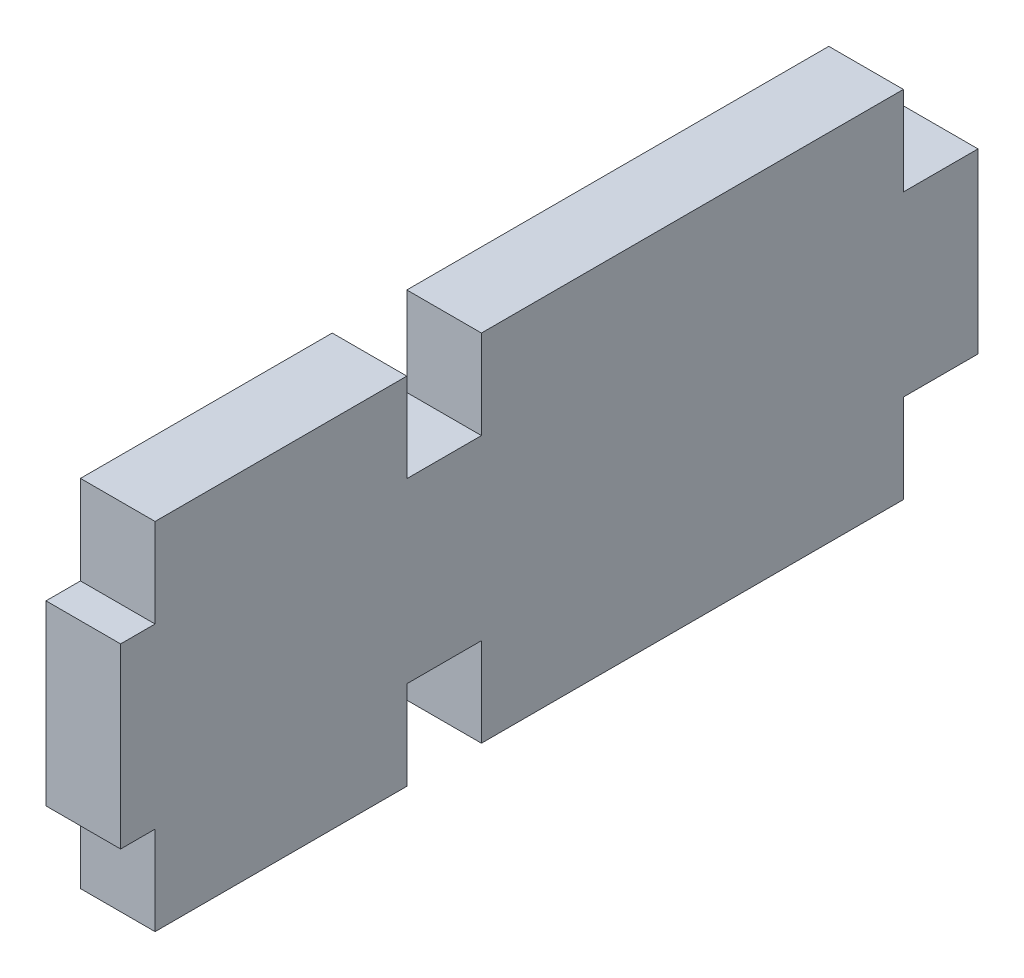
ISO-10303-21;
HEADER;
FILE_DESCRIPTION(('STEP AP214'),'2;1');
FILE_NAME('part.step','',(''),(''),'','','');
FILE_SCHEMA(('AUTOMOTIVE_DESIGN { 1 0 10303 214 1 1 1 1 }'));
ENDSEC;
DATA;
#1=APPLICATION_CONTEXT('core data for automotive mechanical design processes');
#2=APPLICATION_PROTOCOL_DEFINITION('international standard','automotive_design',2000,#1);
#3=PRODUCT_CONTEXT('',#1,'mechanical');
#4=PRODUCT('Part','Part','',(#3));
#5=PRODUCT_RELATED_PRODUCT_CATEGORY('part','',(#4));
#6=PRODUCT_DEFINITION_FORMATION('','',#4);
#7=PRODUCT_DEFINITION_CONTEXT('part definition',#1,'design');
#8=PRODUCT_DEFINITION('design','',#6,#7);
#9=PRODUCT_DEFINITION_SHAPE('','',#8);
#10=(LENGTH_UNIT() NAMED_UNIT(*) SI_UNIT(.MILLI.,.METRE.));
#11=(NAMED_UNIT(*) PLANE_ANGLE_UNIT() SI_UNIT($,.RADIAN.));
#12=(NAMED_UNIT(*) SI_UNIT($,.STERADIAN.) SOLID_ANGLE_UNIT());
#13=UNCERTAINTY_MEASURE_WITH_UNIT(LENGTH_MEASURE(1.E-05),#10,'distance_accuracy_value','');
#14=(GEOMETRIC_REPRESENTATION_CONTEXT(3) GLOBAL_UNCERTAINTY_ASSIGNED_CONTEXT((#13)) GLOBAL_UNIT_ASSIGNED_CONTEXT((#10,
#11,#12)) REPRESENTATION_CONTEXT('',''));
#15=CARTESIAN_POINT('',(0.,0.,0.));
#16=DIRECTION('',(0.,0.,1.));
#17=DIRECTION('',(1.,0.,0.));
#18=AXIS2_PLACEMENT_3D('',#15,#16,#17);
#19=CARTESIAN_POINT('',(5.334,0.,0.));
#20=DIRECTION('',(0.,1.,0.));
#21=DIRECTION('',(0.,0.,1.));
#22=AXIS2_PLACEMENT_3D('',#19,#20,#21);
#23=PLANE('',#22);
#24=DIRECTION('',(0.,0.,-1.));
#25=VECTOR('',#24,1.);
#26=CARTESIAN_POINT('',(0.,0.,0.));
#27=LINE('',#26,#25);
#28=CARTESIAN_POINT('',(0.,0.,-2.4638));
#29=VERTEX_POINT('',#28);
#30=CARTESIAN_POINT('',(0.,0.,-20.4638));
#31=VERTEX_POINT('',#30);
#32=EDGE_CURVE('E202',#29,#31,#27,.T.);
#33=ORIENTED_EDGE('',*,*,#32,.T.);
#34=DIRECTION('',(1.,0.,0.));
#35=VECTOR('',#34,1.);
#36=CARTESIAN_POINT('',(0.,0.,-20.4638));
#37=LINE('',#36,#35);
#38=CARTESIAN_POINT('',(5.334,0.,-20.4638));
#39=VERTEX_POINT('',#38);
#40=EDGE_CURVE('E280',#31,#39,#37,.T.);
#41=ORIENTED_EDGE('',*,*,#40,.T.);
#42=DIRECTION('',(0.,0.,-1.));
#43=VECTOR('',#42,1.);
#44=CARTESIAN_POINT('',(5.334,0.,0.));
#45=LINE('',#44,#43);
#46=CARTESIAN_POINT('',(5.334,0.,-2.4638));
#47=VERTEX_POINT('',#46);
#48=EDGE_CURVE('E218',#47,#39,#45,.T.);
#49=ORIENTED_EDGE('',*,*,#48,.F.);
#50=DIRECTION('',(1.,0.,0.));
#51=VECTOR('',#50,1.);
#52=CARTESIAN_POINT('',(0.,0.,-2.4638));
#53=LINE('',#52,#51);
#54=EDGE_CURVE('E239',#29,#47,#53,.T.);
#55=ORIENTED_EDGE('',*,*,#54,.F.);
#56=EDGE_LOOP('',(#33,#41,#49,#55));
#57=FACE_BOUND('',#56,.T.);
#58=ADVANCED_FACE('F32',(#57),#23,.F.);
#59=CARTESIAN_POINT('',(5.334,25.4,0.));
#60=DIRECTION('',(0.,-1.,0.));
#61=DIRECTION('',(0.,0.,-1.));
#62=AXIS2_PLACEMENT_3D('',#59,#60,#61);
#63=PLANE('',#62);
#64=DIRECTION('',(0.,0.,1.));
#65=VECTOR('',#64,1.);
#66=CARTESIAN_POINT('',(5.334,25.4,0.));
#67=LINE('',#66,#65);
#68=CARTESIAN_POINT('',(5.334,25.4,-20.4638));
#69=VERTEX_POINT('',#68);
#70=CARTESIAN_POINT('',(5.334,25.4,-2.4638));
#71=VERTEX_POINT('',#70);
#72=EDGE_CURVE('E41',#69,#71,#67,.T.);
#73=ORIENTED_EDGE('',*,*,#72,.F.);
#74=DIRECTION('',(1.,0.,0.));
#75=VECTOR('',#74,1.);
#76=CARTESIAN_POINT('',(0.,25.4,-20.4638));
#77=LINE('',#76,#75);
#78=CARTESIAN_POINT('',(0.,25.4,-20.4638));
#79=VERTEX_POINT('',#78);
#80=EDGE_CURVE('E252',#79,#69,#77,.T.);
#81=ORIENTED_EDGE('',*,*,#80,.F.);
#82=DIRECTION('',(0.,0.,1.));
#83=VECTOR('',#82,1.);
#84=CARTESIAN_POINT('',(0.,25.4,0.));
#85=LINE('',#84,#83);
#86=CARTESIAN_POINT('',(0.,25.4,-2.4638));
#87=VERTEX_POINT('',#86);
#88=EDGE_CURVE('E191',#79,#87,#85,.T.);
#89=ORIENTED_EDGE('',*,*,#88,.T.);
#90=DIRECTION('',(1.,0.,0.));
#91=VECTOR('',#90,1.);
#92=CARTESIAN_POINT('',(0.,25.4,-2.4638));
#93=LINE('',#92,#91);
#94=EDGE_CURVE('E213',#87,#71,#93,.T.);
#95=ORIENTED_EDGE('',*,*,#94,.T.);
#96=EDGE_LOOP('',(#73,#81,#89,#95));
#97=FACE_BOUND('',#96,.T.);
#98=ADVANCED_FACE('F378',(#97),#63,.F.);
#99=CARTESIAN_POINT('',(5.334,0.,0.));
#100=DIRECTION('',(0.,0.,-1.));
#101=DIRECTION('',(-1.,0.,0.));
#102=AXIS2_PLACEMENT_3D('',#99,#100,#101);
#103=PLANE('',#102);
#104=DIRECTION('',(0.,-1.,0.));
#105=VECTOR('',#104,1.);
#106=CARTESIAN_POINT('',(0.,0.,0.));
#107=LINE('',#106,#105);
#108=CARTESIAN_POINT('',(0.,19.05,0.));
#109=VERTEX_POINT('',#108);
#110=CARTESIAN_POINT('',(0.,6.35,0.));
#111=VERTEX_POINT('',#110);
#112=EDGE_CURVE('E211',#109,#111,#107,.T.);
#113=ORIENTED_EDGE('',*,*,#112,.T.);
#114=DIRECTION('',(1.,0.,0.));
#115=VECTOR('',#114,1.);
#116=CARTESIAN_POINT('',(0.,6.35,0.));
#117=LINE('',#116,#115);
#118=CARTESIAN_POINT('',(5.334,6.35,0.));
#119=VERTEX_POINT('',#118);
#120=EDGE_CURVE('E234',#111,#119,#117,.T.);
#121=ORIENTED_EDGE('',*,*,#120,.T.);
#122=DIRECTION('',(0.,-1.,0.));
#123=VECTOR('',#122,1.);
#124=CARTESIAN_POINT('',(5.334,0.,0.));
#125=LINE('',#124,#123);
#126=CARTESIAN_POINT('',(5.334,19.05,0.));
#127=VERTEX_POINT('',#126);
#128=EDGE_CURVE('E190',#127,#119,#125,.T.);
#129=ORIENTED_EDGE('',*,*,#128,.F.);
#130=DIRECTION('',(1.,0.,0.));
#131=VECTOR('',#130,1.);
#132=CARTESIAN_POINT('',(0.,19.05,0.));
#133=LINE('',#132,#131);
#134=EDGE_CURVE('E221',#109,#127,#133,.T.);
#135=ORIENTED_EDGE('',*,*,#134,.F.);
#136=EDGE_LOOP('',(#113,#121,#129,#135));
#137=FACE_BOUND('',#136,.T.);
#138=ADVANCED_FACE('F34',(#137),#103,.F.);
#139=CARTESIAN_POINT('',(0.,0.,-25.7978));
#140=VERTEX_POINT('',#139);
#141=CARTESIAN_POINT('',(0.,0.,-55.966));
#142=VERTEX_POINT('',#141);
#143=EDGE_CURVE('E208',#140,#142,#27,.T.);
#144=ORIENTED_EDGE('',*,*,#143,.T.);
#145=DIRECTION('',(1.,0.,0.));
#146=VECTOR('',#145,1.);
#147=CARTESIAN_POINT('',(0.,0.,-55.966));
#148=LINE('',#147,#146);
#149=CARTESIAN_POINT('',(5.334,0.,-55.966));
#150=VERTEX_POINT('',#149);
#151=EDGE_CURVE('E298',#142,#150,#148,.T.);
#152=ORIENTED_EDGE('',*,*,#151,.T.);
#153=CARTESIAN_POINT('',(5.334,0.,-25.7978));
#154=VERTEX_POINT('',#153);
#155=EDGE_CURVE('E193',#154,#150,#45,.T.);
#156=ORIENTED_EDGE('',*,*,#155,.F.);
#157=DIRECTION('',(1.,0.,0.));
#158=VECTOR('',#157,1.);
#159=CARTESIAN_POINT('',(0.,0.,-25.7978));
#160=LINE('',#159,#158);
#161=EDGE_CURVE('E283',#140,#154,#160,.T.);
#162=ORIENTED_EDGE('',*,*,#161,.F.);
#163=EDGE_LOOP('',(#144,#152,#156,#162));
#164=FACE_BOUND('',#163,.T.);
#165=ADVANCED_FACE('F343',(#164),#23,.F.);
#166=CARTESIAN_POINT('',(5.334,0.,-61.3));
#167=DIRECTION('',(0.,0.,1.));
#168=DIRECTION('',(1.,0.,0.));
#169=AXIS2_PLACEMENT_3D('',#166,#167,#168);
#170=PLANE('',#169);
#171=DIRECTION('',(0.,1.,0.));
#172=VECTOR('',#171,1.);
#173=CARTESIAN_POINT('',(0.,0.,-61.3));
#174=LINE('',#173,#172);
#175=CARTESIAN_POINT('',(0.,6.35,-61.3));
#176=VERTEX_POINT('',#175);
#177=CARTESIAN_POINT('',(0.,19.05,-61.3));
#178=VERTEX_POINT('',#177);
#179=EDGE_CURVE('E195',#176,#178,#174,.T.);
#180=ORIENTED_EDGE('',*,*,#179,.T.);
#181=DIRECTION('',(1.,0.,0.));
#182=VECTOR('',#181,1.);
#183=CARTESIAN_POINT('',(0.,19.05,-61.3));
#184=LINE('',#183,#182);
#185=CARTESIAN_POINT('',(5.334,19.05,-61.3));
#186=VERTEX_POINT('',#185);
#187=EDGE_CURVE('E318',#178,#186,#184,.T.);
#188=ORIENTED_EDGE('',*,*,#187,.T.);
#189=DIRECTION('',(0.,1.,0.));
#190=VECTOR('',#189,1.);
#191=CARTESIAN_POINT('',(5.334,0.,-61.3));
#192=LINE('',#191,#190);
#193=CARTESIAN_POINT('',(5.334,6.35,-61.3));
#194=VERTEX_POINT('',#193);
#195=EDGE_CURVE('E215',#194,#186,#192,.T.);
#196=ORIENTED_EDGE('',*,*,#195,.F.);
#197=DIRECTION('',(1.,0.,0.));
#198=VECTOR('',#197,1.);
#199=CARTESIAN_POINT('',(0.,6.35,-61.3));
#200=LINE('',#199,#198);
#201=EDGE_CURVE('E306',#176,#194,#200,.T.);
#202=ORIENTED_EDGE('',*,*,#201,.F.);
#203=EDGE_LOOP('',(#180,#188,#196,#202));
#204=FACE_BOUND('',#203,.T.);
#205=ADVANCED_FACE('F333',(#204),#170,.F.);
#206=CARTESIAN_POINT('',(5.334,25.4,-55.966));
#207=VERTEX_POINT('',#206);
#208=CARTESIAN_POINT('',(5.334,25.4,-25.7978));
#209=VERTEX_POINT('',#208);
#210=EDGE_CURVE('E11',#207,#209,#67,.T.);
#211=ORIENTED_EDGE('',*,*,#210,.F.);
#212=DIRECTION('',(1.,0.,0.));
#213=VECTOR('',#212,1.);
#214=CARTESIAN_POINT('',(0.,25.4,-55.966));
#215=LINE('',#214,#213);
#216=CARTESIAN_POINT('',(0.,25.4,-55.966));
#217=VERTEX_POINT('',#216);
#218=EDGE_CURVE('E173',#217,#207,#215,.T.);
#219=ORIENTED_EDGE('',*,*,#218,.F.);
#220=CARTESIAN_POINT('',(0.,25.4,-25.7978));
#221=VERTEX_POINT('',#220);
#222=EDGE_CURVE('E36',#217,#221,#85,.T.);
#223=ORIENTED_EDGE('',*,*,#222,.T.);
#224=DIRECTION('',(1.,0.,0.));
#225=VECTOR('',#224,1.);
#226=CARTESIAN_POINT('',(0.,25.4,-25.7978));
#227=LINE('',#226,#225);
#228=EDGE_CURVE('E261',#221,#209,#227,.T.);
#229=ORIENTED_EDGE('',*,*,#228,.T.);
#230=EDGE_LOOP('',(#211,#219,#223,#229));
#231=FACE_BOUND('',#230,.T.);
#232=ADVANCED_FACE('F182',(#231),#63,.F.);
#233=CARTESIAN_POINT('',(5.334,0.,0.));
#234=DIRECTION('',(-1.,0.,0.));
#235=DIRECTION('',(0.,0.,1.));
#236=AXIS2_PLACEMENT_3D('',#233,#234,#235);
#237=PLANE('',#236);
#238=ORIENTED_EDGE('',*,*,#195,.T.);
#239=DIRECTION('',(0.,0.,-1.));
#240=VECTOR('',#239,1.);
#241=CARTESIAN_POINT('',(5.334,19.05,-61.3));
#242=LINE('',#241,#240);
#243=CARTESIAN_POINT('',(5.334,19.05,-55.966));
#244=VERTEX_POINT('',#243);
#245=EDGE_CURVE('E178',#244,#186,#242,.T.);
#246=ORIENTED_EDGE('',*,*,#245,.F.);
#247=DIRECTION('',(0.,-1.,0.));
#248=VECTOR('',#247,1.);
#249=CARTESIAN_POINT('',(5.334,25.4,-55.966));
#250=LINE('',#249,#248);
#251=EDGE_CURVE('E325',#207,#244,#250,.T.);
#252=ORIENTED_EDGE('',*,*,#251,.F.);
#253=ORIENTED_EDGE('',*,*,#210,.T.);
#254=DIRECTION('',(0.,1.,0.));
#255=VECTOR('',#254,1.);
#256=CARTESIAN_POINT('',(5.334,25.4,-25.7978));
#257=LINE('',#256,#255);
#258=CARTESIAN_POINT('',(5.334,19.05,-25.7978));
#259=VERTEX_POINT('',#258);
#260=EDGE_CURVE('E264',#259,#209,#257,.T.);
#261=ORIENTED_EDGE('',*,*,#260,.F.);
#262=DIRECTION('',(0.,0.,-1.));
#263=VECTOR('',#262,1.);
#264=CARTESIAN_POINT('',(5.334,19.05,-20.4638));
#265=LINE('',#264,#263);
#266=CARTESIAN_POINT('',(5.334,19.05,-20.4638));
#267=VERTEX_POINT('',#266);
#268=EDGE_CURVE('E268',#267,#259,#265,.T.);
#269=ORIENTED_EDGE('',*,*,#268,.F.);
#270=DIRECTION('',(0.,-1.,0.));
#271=VECTOR('',#270,1.);
#272=CARTESIAN_POINT('',(5.334,25.4,-20.4638));
#273=LINE('',#272,#271);
#274=EDGE_CURVE('E271',#69,#267,#273,.T.);
#275=ORIENTED_EDGE('',*,*,#274,.F.);
#276=ORIENTED_EDGE('',*,*,#72,.T.);
#277=DIRECTION('',(0.,1.,0.));
#278=VECTOR('',#277,1.);
#279=CARTESIAN_POINT('',(5.334,25.4,-2.4638));
#280=LINE('',#279,#278);
#281=CARTESIAN_POINT('',(5.334,19.05,-2.4638));
#282=VERTEX_POINT('',#281);
#283=EDGE_CURVE('E227',#282,#71,#280,.T.);
#284=ORIENTED_EDGE('',*,*,#283,.F.);
#285=DIRECTION('',(0.,0.,-1.));
#286=VECTOR('',#285,1.);
#287=CARTESIAN_POINT('',(5.334,19.05,0.));
#288=LINE('',#287,#286);
#289=EDGE_CURVE('E231',#127,#282,#288,.T.);
#290=ORIENTED_EDGE('',*,*,#289,.F.);
#291=ORIENTED_EDGE('',*,*,#128,.T.);
#292=DIRECTION('',(0.,0.,1.));
#293=VECTOR('',#292,1.);
#294=CARTESIAN_POINT('',(5.334,6.35,0.));
#295=LINE('',#294,#293);
#296=CARTESIAN_POINT('',(5.334,6.35,-2.4638));
#297=VERTEX_POINT('',#296);
#298=EDGE_CURVE('E246',#297,#119,#295,.T.);
#299=ORIENTED_EDGE('',*,*,#298,.F.);
#300=DIRECTION('',(0.,1.,0.));
#301=VECTOR('',#300,1.);
#302=CARTESIAN_POINT('',(5.334,0.,-2.4638));
#303=LINE('',#302,#301);
#304=EDGE_CURVE('E249',#47,#297,#303,.T.);
#305=ORIENTED_EDGE('',*,*,#304,.F.);
#306=ORIENTED_EDGE('',*,*,#48,.T.);
#307=DIRECTION('',(0.,-1.,0.));
#308=VECTOR('',#307,1.);
#309=CARTESIAN_POINT('',(5.334,0.,-20.4638));
#310=LINE('',#309,#308);
#311=CARTESIAN_POINT('',(5.334,6.35,-20.4638));
#312=VERTEX_POINT('',#311);
#313=EDGE_CURVE('E296',#312,#39,#310,.T.);
#314=ORIENTED_EDGE('',*,*,#313,.F.);
#315=DIRECTION('',(0.,0.,1.));
#316=VECTOR('',#315,1.);
#317=CARTESIAN_POINT('',(5.334,6.35,-20.4638));
#318=LINE('',#317,#316);
#319=CARTESIAN_POINT('',(5.334,6.35,-25.7978));
#320=VERTEX_POINT('',#319);
#321=EDGE_CURVE('E289',#320,#312,#318,.T.);
#322=ORIENTED_EDGE('',*,*,#321,.F.);
#323=DIRECTION('',(0.,1.,0.));
#324=VECTOR('',#323,1.);
#325=CARTESIAN_POINT('',(5.334,0.,-25.7978));
#326=LINE('',#325,#324);
#327=EDGE_CURVE('E293',#154,#320,#326,.T.);
#328=ORIENTED_EDGE('',*,*,#327,.F.);
#329=ORIENTED_EDGE('',*,*,#155,.T.);
#330=DIRECTION('',(0.,-1.,0.));
#331=VECTOR('',#330,1.);
#332=CARTESIAN_POINT('',(5.334,0.,-55.966));
#333=LINE('',#332,#331);
#334=CARTESIAN_POINT('',(5.334,6.35,-55.966));
#335=VERTEX_POINT('',#334);
#336=EDGE_CURVE('E312',#335,#150,#333,.T.);
#337=ORIENTED_EDGE('',*,*,#336,.F.);
#338=DIRECTION('',(0.,0.,1.));
#339=VECTOR('',#338,1.);
#340=CARTESIAN_POINT('',(5.334,6.35,-61.3));
#341=LINE('',#340,#339);
#342=EDGE_CURVE('E315',#194,#335,#341,.T.);
#343=ORIENTED_EDGE('',*,*,#342,.F.);
#344=EDGE_LOOP('',(#238,#246,#252,#253,#261,#269,#275,#276,#284,#290,#291,#299,#305,#306,#314,
#322,#328,#329,#337,#343));
#345=FACE_BOUND('',#344,.T.);
#346=ADVANCED_FACE('F336',(#345),#237,.F.);
#347=CARTESIAN_POINT('',(0.,0.,0.));
#348=DIRECTION('',(-1.,0.,0.));
#349=DIRECTION('',(0.,0.,1.));
#350=AXIS2_PLACEMENT_3D('',#347,#348,#349);
#351=PLANE('',#350);
#352=DIRECTION('',(0.,0.,-1.));
#353=VECTOR('',#352,1.);
#354=CARTESIAN_POINT('',(0.,19.05,-61.3));
#355=LINE('',#354,#353);
#356=CARTESIAN_POINT('',(0.,19.05,-55.966));
#357=VERTEX_POINT('',#356);
#358=EDGE_CURVE('E49',#357,#178,#355,.T.);
#359=ORIENTED_EDGE('',*,*,#358,.T.);
#360=ORIENTED_EDGE('',*,*,#179,.F.);
#361=DIRECTION('',(0.,0.,1.));
#362=VECTOR('',#361,1.);
#363=CARTESIAN_POINT('',(0.,6.35,-61.3));
#364=LINE('',#363,#362);
#365=CARTESIAN_POINT('',(0.,6.35,-55.966));
#366=VERTEX_POINT('',#365);
#367=EDGE_CURVE('E314',#176,#366,#364,.T.);
#368=ORIENTED_EDGE('',*,*,#367,.T.);
#369=DIRECTION('',(0.,-1.,0.));
#370=VECTOR('',#369,1.);
#371=CARTESIAN_POINT('',(0.,0.,-55.966));
#372=LINE('',#371,#370);
#373=EDGE_CURVE('E57',#366,#142,#372,.T.);
#374=ORIENTED_EDGE('',*,*,#373,.T.);
#375=ORIENTED_EDGE('',*,*,#143,.F.);
#376=DIRECTION('',(0.,1.,0.));
#377=VECTOR('',#376,1.);
#378=CARTESIAN_POINT('',(0.,0.,-25.7978));
#379=LINE('',#378,#377);
#380=CARTESIAN_POINT('',(0.,6.35,-25.7978));
#381=VERTEX_POINT('',#380);
#382=EDGE_CURVE('E301',#140,#381,#379,.T.);
#383=ORIENTED_EDGE('',*,*,#382,.T.);
#384=DIRECTION('',(0.,0.,1.));
#385=VECTOR('',#384,1.);
#386=CARTESIAN_POINT('',(0.,6.35,-20.4638));
#387=LINE('',#386,#385);
#388=CARTESIAN_POINT('',(0.,6.35,-20.4638));
#389=VERTEX_POINT('',#388);
#390=EDGE_CURVE('E284',#381,#389,#387,.T.);
#391=ORIENTED_EDGE('',*,*,#390,.T.);
#392=DIRECTION('',(0.,-1.,0.));
#393=VECTOR('',#392,1.);
#394=CARTESIAN_POINT('',(0.,0.,-20.4638));
#395=LINE('',#394,#393);
#396=EDGE_CURVE('E292',#389,#31,#395,.T.);
#397=ORIENTED_EDGE('',*,*,#396,.T.);
#398=ORIENTED_EDGE('',*,*,#32,.F.);
#399=DIRECTION('',(0.,1.,0.));
#400=VECTOR('',#399,1.);
#401=CARTESIAN_POINT('',(0.,0.,-2.4638));
#402=LINE('',#401,#400);
#403=CARTESIAN_POINT('',(0.,6.35,-2.4638));
#404=VERTEX_POINT('',#403);
#405=EDGE_CURVE('E248',#29,#404,#402,.T.);
#406=ORIENTED_EDGE('',*,*,#405,.T.);
#407=DIRECTION('',(0.,0.,1.));
#408=VECTOR('',#407,1.);
#409=CARTESIAN_POINT('',(0.,6.35,0.));
#410=LINE('',#409,#408);
#411=EDGE_CURVE('E242',#404,#111,#410,.T.);
#412=ORIENTED_EDGE('',*,*,#411,.T.);
#413=ORIENTED_EDGE('',*,*,#112,.F.);
#414=DIRECTION('',(0.,0.,-1.));
#415=VECTOR('',#414,1.);
#416=CARTESIAN_POINT('',(0.,19.05,0.));
#417=LINE('',#416,#415);
#418=CARTESIAN_POINT('',(0.,19.05,-2.4638));
#419=VERTEX_POINT('',#418);
#420=EDGE_CURVE('E230',#109,#419,#417,.T.);
#421=ORIENTED_EDGE('',*,*,#420,.T.);
#422=DIRECTION('',(0.,1.,0.));
#423=VECTOR('',#422,1.);
#424=CARTESIAN_POINT('',(0.,25.4,-2.4638));
#425=LINE('',#424,#423);
#426=EDGE_CURVE('E224',#419,#87,#425,.T.);
#427=ORIENTED_EDGE('',*,*,#426,.T.);
#428=ORIENTED_EDGE('',*,*,#88,.F.);
#429=DIRECTION('',(0.,-1.,0.));
#430=VECTOR('',#429,1.);
#431=CARTESIAN_POINT('',(0.,25.4,-20.4638));
#432=LINE('',#431,#430);
#433=CARTESIAN_POINT('',(0.,19.05,-20.4638));
#434=VERTEX_POINT('',#433);
#435=EDGE_CURVE('E267',#79,#434,#432,.T.);
#436=ORIENTED_EDGE('',*,*,#435,.T.);
#437=DIRECTION('',(0.,0.,-1.));
#438=VECTOR('',#437,1.);
#439=CARTESIAN_POINT('',(0.,19.05,-20.4638));
#440=LINE('',#439,#438);
#441=CARTESIAN_POINT('',(0.,19.05,-25.7978));
#442=VERTEX_POINT('',#441);
#443=EDGE_CURVE('E276',#434,#442,#440,.T.);
#444=ORIENTED_EDGE('',*,*,#443,.T.);
#445=DIRECTION('',(0.,1.,0.));
#446=VECTOR('',#445,1.);
#447=CARTESIAN_POINT('',(0.,25.4,-25.7978));
#448=LINE('',#447,#446);
#449=EDGE_CURVE('E189',#442,#221,#448,.T.);
#450=ORIENTED_EDGE('',*,*,#449,.T.);
#451=ORIENTED_EDGE('',*,*,#222,.F.);
#452=DIRECTION('',(0.,-1.,0.));
#453=VECTOR('',#452,1.);
#454=CARTESIAN_POINT('',(0.,25.4,-55.966));
#455=LINE('',#454,#453);
#456=EDGE_CURVE('E169',#217,#357,#455,.T.);
#457=ORIENTED_EDGE('',*,*,#456,.T.);
#458=EDGE_LOOP('',(#359,#360,#368,#374,#375,#383,#391,#397,#398,#406,#412,#413,#421,#427,#428,
#436,#444,#450,#451,#457));
#459=FACE_BOUND('',#458,.T.);
#460=ADVANCED_FACE('F187',(#459),#351,.T.);
#461=CARTESIAN_POINT('',(0.,25.4,-2.4638));
#462=DIRECTION('',(0.,0.,-1.));
#463=DIRECTION('',(-1.,0.,0.));
#464=AXIS2_PLACEMENT_3D('',#461,#462,#463);
#465=PLANE('',#464);
#466=ORIENTED_EDGE('',*,*,#283,.T.);
#467=ORIENTED_EDGE('',*,*,#94,.F.);
#468=ORIENTED_EDGE('',*,*,#426,.F.);
#469=DIRECTION('',(1.,0.,0.));
#470=VECTOR('',#469,1.);
#471=CARTESIAN_POINT('',(0.,19.05,-2.4638));
#472=LINE('',#471,#470);
#473=EDGE_CURVE('E223',#419,#282,#472,.T.);
#474=ORIENTED_EDGE('',*,*,#473,.T.);
#475=EDGE_LOOP('',(#466,#467,#468,#474));
#476=FACE_BOUND('',#475,.T.);
#477=ADVANCED_FACE('F376',(#476),#465,.F.);
#478=CARTESIAN_POINT('',(0.,19.05,0.));
#479=DIRECTION('',(0.,-1.,0.));
#480=DIRECTION('',(0.,0.,-1.));
#481=AXIS2_PLACEMENT_3D('',#478,#479,#480);
#482=PLANE('',#481);
#483=ORIENTED_EDGE('',*,*,#289,.T.);
#484=ORIENTED_EDGE('',*,*,#473,.F.);
#485=ORIENTED_EDGE('',*,*,#420,.F.);
#486=ORIENTED_EDGE('',*,*,#134,.T.);
#487=EDGE_LOOP('',(#483,#484,#485,#486));
#488=FACE_BOUND('',#487,.T.);
#489=ADVANCED_FACE('F373',(#488),#482,.F.);
#490=CARTESIAN_POINT('',(0.,6.35,0.));
#491=DIRECTION('',(0.,1.,0.));
#492=DIRECTION('',(0.,0.,1.));
#493=AXIS2_PLACEMENT_3D('',#490,#491,#492);
#494=PLANE('',#493);
#495=ORIENTED_EDGE('',*,*,#298,.T.);
#496=ORIENTED_EDGE('',*,*,#120,.F.);
#497=ORIENTED_EDGE('',*,*,#411,.F.);
#498=DIRECTION('',(1.,0.,0.));
#499=VECTOR('',#498,1.);
#500=CARTESIAN_POINT('',(0.,6.35,-2.4638));
#501=LINE('',#500,#499);
#502=EDGE_CURVE('E241',#404,#297,#501,.T.);
#503=ORIENTED_EDGE('',*,*,#502,.T.);
#504=EDGE_LOOP('',(#495,#496,#497,#503));
#505=FACE_BOUND('',#504,.T.);
#506=ADVANCED_FACE('F367',(#505),#494,.F.);
#507=CARTESIAN_POINT('',(0.,0.,-2.4638));
#508=DIRECTION('',(0.,0.,-1.));
#509=DIRECTION('',(-1.,0.,0.));
#510=AXIS2_PLACEMENT_3D('',#507,#508,#509);
#511=PLANE('',#510);
#512=ORIENTED_EDGE('',*,*,#304,.T.);
#513=ORIENTED_EDGE('',*,*,#502,.F.);
#514=ORIENTED_EDGE('',*,*,#405,.F.);
#515=ORIENTED_EDGE('',*,*,#54,.T.);
#516=EDGE_LOOP('',(#512,#513,#514,#515));
#517=FACE_BOUND('',#516,.T.);
#518=ADVANCED_FACE('F361',(#517),#511,.F.);
#519=CARTESIAN_POINT('',(0.,25.4,-20.4638));
#520=DIRECTION('',(0.,0.,1.));
#521=DIRECTION('',(1.,0.,0.));
#522=AXIS2_PLACEMENT_3D('',#519,#520,#521);
#523=PLANE('',#522);
#524=ORIENTED_EDGE('',*,*,#274,.T.);
#525=DIRECTION('',(1.,0.,0.));
#526=VECTOR('',#525,1.);
#527=CARTESIAN_POINT('',(0.,19.05,-20.4638));
#528=LINE('',#527,#526);
#529=EDGE_CURVE('E257',#434,#267,#528,.T.);
#530=ORIENTED_EDGE('',*,*,#529,.F.);
#531=ORIENTED_EDGE('',*,*,#435,.F.);
#532=ORIENTED_EDGE('',*,*,#80,.T.);
#533=EDGE_LOOP('',(#524,#530,#531,#532));
#534=FACE_BOUND('',#533,.T.);
#535=ADVANCED_FACE('F383',(#534),#523,.F.);
#536=CARTESIAN_POINT('',(0.,25.4,-25.7978));
#537=DIRECTION('',(0.,0.,-1.));
#538=DIRECTION('',(-1.,0.,0.));
#539=AXIS2_PLACEMENT_3D('',#536,#537,#538);
#540=PLANE('',#539);
#541=ORIENTED_EDGE('',*,*,#260,.T.);
#542=ORIENTED_EDGE('',*,*,#228,.F.);
#543=ORIENTED_EDGE('',*,*,#449,.F.);
#544=DIRECTION('',(1.,0.,0.));
#545=VECTOR('',#544,1.);
#546=CARTESIAN_POINT('',(0.,19.05,-25.7978));
#547=LINE('',#546,#545);
#548=EDGE_CURVE('E259',#442,#259,#547,.T.);
#549=ORIENTED_EDGE('',*,*,#548,.T.);
#550=EDGE_LOOP('',(#541,#542,#543,#549));
#551=FACE_BOUND('',#550,.T.);
#552=ADVANCED_FACE('F389',(#551),#540,.F.);
#553=CARTESIAN_POINT('',(0.,19.05,-20.4638));
#554=DIRECTION('',(0.,-1.,0.));
#555=DIRECTION('',(0.,0.,-1.));
#556=AXIS2_PLACEMENT_3D('',#553,#554,#555);
#557=PLANE('',#556);
#558=ORIENTED_EDGE('',*,*,#268,.T.);
#559=ORIENTED_EDGE('',*,*,#548,.F.);
#560=ORIENTED_EDGE('',*,*,#443,.F.);
#561=ORIENTED_EDGE('',*,*,#529,.T.);
#562=EDGE_LOOP('',(#558,#559,#560,#561));
#563=FACE_BOUND('',#562,.T.);
#564=ADVANCED_FACE('F387',(#563),#557,.F.);
#565=CARTESIAN_POINT('',(0.,0.,-20.4638));
#566=DIRECTION('',(0.,0.,1.));
#567=DIRECTION('',(1.,0.,0.));
#568=AXIS2_PLACEMENT_3D('',#565,#566,#567);
#569=PLANE('',#568);
#570=ORIENTED_EDGE('',*,*,#313,.T.);
#571=ORIENTED_EDGE('',*,*,#40,.F.);
#572=ORIENTED_EDGE('',*,*,#396,.F.);
#573=DIRECTION('',(1.,0.,0.));
#574=VECTOR('',#573,1.);
#575=CARTESIAN_POINT('',(0.,6.35,-20.4638));
#576=LINE('',#575,#574);
#577=EDGE_CURVE('E274',#389,#312,#576,.T.);
#578=ORIENTED_EDGE('',*,*,#577,.T.);
#579=EDGE_LOOP('',(#570,#571,#572,#578));
#580=FACE_BOUND('',#579,.T.);
#581=ADVANCED_FACE('F354',(#580),#569,.F.);
#582=CARTESIAN_POINT('',(0.,6.35,-20.4638));
#583=DIRECTION('',(0.,1.,0.));
#584=DIRECTION('',(0.,0.,1.));
#585=AXIS2_PLACEMENT_3D('',#582,#583,#584);
#586=PLANE('',#585);
#587=ORIENTED_EDGE('',*,*,#321,.T.);
#588=ORIENTED_EDGE('',*,*,#577,.F.);
#589=ORIENTED_EDGE('',*,*,#390,.F.);
#590=DIRECTION('',(1.,0.,0.));
#591=VECTOR('',#590,1.);
#592=CARTESIAN_POINT('',(0.,6.35,-25.7978));
#593=LINE('',#592,#591);
#594=EDGE_CURVE('E286',#381,#320,#593,.T.);
#595=ORIENTED_EDGE('',*,*,#594,.T.);
#596=EDGE_LOOP('',(#587,#588,#589,#595));
#597=FACE_BOUND('',#596,.T.);
#598=ADVANCED_FACE('F350',(#597),#586,.F.);
#599=CARTESIAN_POINT('',(0.,0.,-25.7978));
#600=DIRECTION('',(0.,0.,-1.));
#601=DIRECTION('',(-1.,0.,0.));
#602=AXIS2_PLACEMENT_3D('',#599,#600,#601);
#603=PLANE('',#602);
#604=ORIENTED_EDGE('',*,*,#327,.T.);
#605=ORIENTED_EDGE('',*,*,#594,.F.);
#606=ORIENTED_EDGE('',*,*,#382,.F.);
#607=ORIENTED_EDGE('',*,*,#161,.T.);
#608=EDGE_LOOP('',(#604,#605,#606,#607));
#609=FACE_BOUND('',#608,.T.);
#610=ADVANCED_FACE('F347',(#609),#603,.F.);
#611=CARTESIAN_POINT('',(0.,0.,-55.966));
#612=DIRECTION('',(0.,0.,1.));
#613=DIRECTION('',(1.,0.,0.));
#614=AXIS2_PLACEMENT_3D('',#611,#612,#613);
#615=PLANE('',#614);
#616=ORIENTED_EDGE('',*,*,#336,.T.);
#617=ORIENTED_EDGE('',*,*,#151,.F.);
#618=ORIENTED_EDGE('',*,*,#373,.F.);
#619=DIRECTION('',(1.,0.,0.));
#620=VECTOR('',#619,1.);
#621=CARTESIAN_POINT('',(0.,6.35,-55.966));
#622=LINE('',#621,#620);
#623=EDGE_CURVE('E308',#366,#335,#622,.T.);
#624=ORIENTED_EDGE('',*,*,#623,.T.);
#625=EDGE_LOOP('',(#616,#617,#618,#624));
#626=FACE_BOUND('',#625,.T.);
#627=ADVANCED_FACE('F341',(#626),#615,.F.);
#628=CARTESIAN_POINT('',(0.,6.35,-61.3));
#629=DIRECTION('',(0.,1.,0.));
#630=DIRECTION('',(0.,0.,1.));
#631=AXIS2_PLACEMENT_3D('',#628,#629,#630);
#632=PLANE('',#631);
#633=ORIENTED_EDGE('',*,*,#342,.T.);
#634=ORIENTED_EDGE('',*,*,#623,.F.);
#635=ORIENTED_EDGE('',*,*,#367,.F.);
#636=ORIENTED_EDGE('',*,*,#201,.T.);
#637=EDGE_LOOP('',(#633,#634,#635,#636));
#638=FACE_BOUND('',#637,.T.);
#639=ADVANCED_FACE('F330',(#638),#632,.F.);
#640=CARTESIAN_POINT('',(0.,19.05,-61.3));
#641=DIRECTION('',(0.,-1.,0.));
#642=DIRECTION('',(0.,0.,-1.));
#643=AXIS2_PLACEMENT_3D('',#640,#641,#642);
#644=PLANE('',#643);
#645=ORIENTED_EDGE('',*,*,#245,.T.);
#646=ORIENTED_EDGE('',*,*,#187,.F.);
#647=ORIENTED_EDGE('',*,*,#358,.F.);
#648=DIRECTION('',(1.,0.,0.));
#649=VECTOR('',#648,1.);
#650=CARTESIAN_POINT('',(0.,19.05,-55.966));
#651=LINE('',#650,#649);
#652=EDGE_CURVE('E175',#357,#244,#651,.T.);
#653=ORIENTED_EDGE('',*,*,#652,.T.);
#654=EDGE_LOOP('',(#645,#646,#647,#653));
#655=FACE_BOUND('',#654,.T.);
#656=ADVANCED_FACE('F501',(#655),#644,.F.);
#657=CARTESIAN_POINT('',(0.,25.4,-55.966));
#658=DIRECTION('',(0.,0.,1.));
#659=DIRECTION('',(1.,0.,0.));
#660=AXIS2_PLACEMENT_3D('',#657,#658,#659);
#661=PLANE('',#660);
#662=ORIENTED_EDGE('',*,*,#251,.T.);
#663=ORIENTED_EDGE('',*,*,#652,.F.);
#664=ORIENTED_EDGE('',*,*,#456,.F.);
#665=ORIENTED_EDGE('',*,*,#218,.T.);
#666=EDGE_LOOP('',(#662,#663,#664,#665));
#667=FACE_BOUND('',#666,.T.);
#668=ADVANCED_FACE('F172',(#667),#661,.F.);
#669=CLOSED_SHELL('',(#58,#98,#138,#165,#205,#232,#346,#460,#477,#489,#506,#518,#535,#552,#564,
#581,#598,#610,#627,#639,#656,#668));
#670=MANIFOLD_SOLID_BREP('B2',#669);
#671=ADVANCED_BREP_SHAPE_REPRESENTATION('',(#18,#670),#14);
#672=SHAPE_DEFINITION_REPRESENTATION(#9,#671);
ENDSEC;
END-ISO-10303-21;
